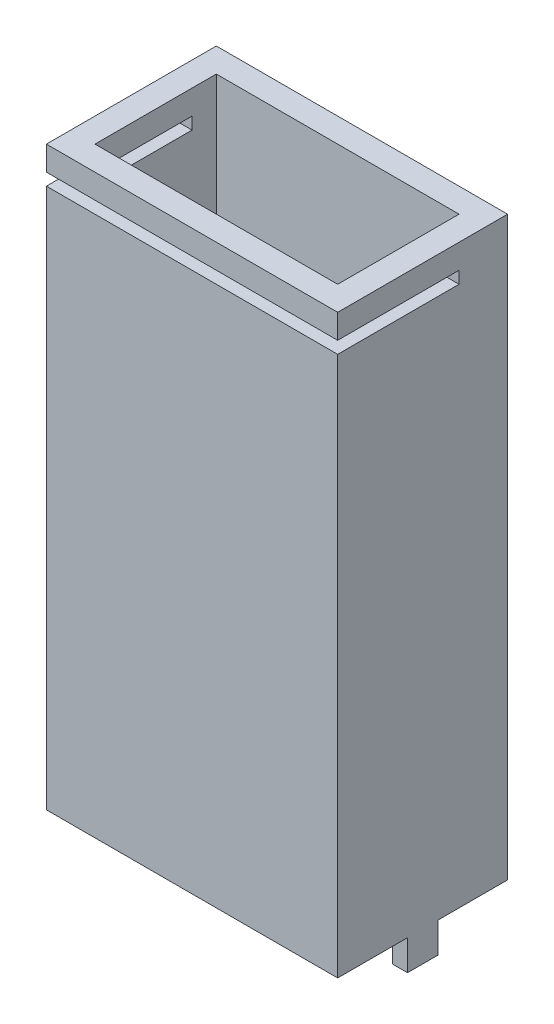
ISO-10303-21;
HEADER;
FILE_DESCRIPTION(('STEP AP214'),'2;1');
FILE_NAME('part.step','',(''),(''),'','','');
FILE_SCHEMA(('AUTOMOTIVE_DESIGN { 1 0 10303 214 1 1 1 1 }'));
ENDSEC;
DATA;
#1=APPLICATION_CONTEXT('core data for automotive mechanical design processes');
#2=APPLICATION_PROTOCOL_DEFINITION('international standard','automotive_design',2000,#1);
#3=PRODUCT_CONTEXT('',#1,'mechanical');
#4=PRODUCT('Part','Part','',(#3));
#5=PRODUCT_RELATED_PRODUCT_CATEGORY('part','',(#4));
#6=PRODUCT_DEFINITION_FORMATION('','',#4);
#7=PRODUCT_DEFINITION_CONTEXT('part definition',#1,'design');
#8=PRODUCT_DEFINITION('design','',#6,#7);
#9=PRODUCT_DEFINITION_SHAPE('','',#8);
#10=(LENGTH_UNIT() NAMED_UNIT(*) SI_UNIT(.MILLI.,.METRE.));
#11=(NAMED_UNIT(*) PLANE_ANGLE_UNIT() SI_UNIT($,.RADIAN.));
#12=(NAMED_UNIT(*) SI_UNIT($,.STERADIAN.) SOLID_ANGLE_UNIT());
#13=UNCERTAINTY_MEASURE_WITH_UNIT(LENGTH_MEASURE(1.E-05),#10,'distance_accuracy_value','');
#14=(GEOMETRIC_REPRESENTATION_CONTEXT(3) GLOBAL_UNCERTAINTY_ASSIGNED_CONTEXT((#13)) GLOBAL_UNIT_ASSIGNED_CONTEXT((#10,
#11,#12)) REPRESENTATION_CONTEXT('',''));
#15=CARTESIAN_POINT('',(0.,0.,0.));
#16=DIRECTION('',(0.,0.,1.));
#17=DIRECTION('',(1.,0.,0.));
#18=AXIS2_PLACEMENT_3D('',#15,#16,#17);
#19=CARTESIAN_POINT('',(-4.,95.,24.));
#20=DIRECTION('',(0.,0.,-1.));
#21=DIRECTION('',(-1.,0.,0.));
#22=AXIS2_PLACEMENT_3D('',#19,#20,#21);
#23=PLANE('',#22);
#24=DIRECTION('',(0.,-1.,0.));
#25=VECTOR('',#24,1.);
#26=CARTESIAN_POINT('',(-4.,95.,24.));
#27=LINE('',#26,#25);
#28=CARTESIAN_POINT('',(-4.,95.,24.));
#29=VERTEX_POINT('',#28);
#30=CARTESIAN_POINT('',(-4.,91.,24.));
#31=VERTEX_POINT('',#30);
#32=EDGE_CURVE('E405',#29,#31,#27,.T.);
#33=ORIENTED_EDGE('',*,*,#32,.T.);
#34=DIRECTION('',(-1.,0.,0.));
#35=VECTOR('',#34,1.);
#36=CARTESIAN_POINT('',(-6.59729798073271,91.,24.));
#37=LINE('',#36,#35);
#38=CARTESIAN_POINT('',(44.,91.,24.));
#39=VERTEX_POINT('',#38);
#40=EDGE_CURVE('E496',#39,#31,#37,.T.);
#41=ORIENTED_EDGE('',*,*,#40,.F.);
#42=DIRECTION('',(0.,-1.,0.));
#43=VECTOR('',#42,1.);
#44=CARTESIAN_POINT('',(44.,95.,24.));
#45=LINE('',#44,#43);
#46=CARTESIAN_POINT('',(44.,95.,24.));
#47=VERTEX_POINT('',#46);
#48=EDGE_CURVE('E226',#47,#39,#45,.T.);
#49=ORIENTED_EDGE('',*,*,#48,.F.);
#50=DIRECTION('',(1.,0.,0.));
#51=VECTOR('',#50,1.);
#52=CARTESIAN_POINT('',(-4.,95.,24.));
#53=LINE('',#52,#51);
#54=EDGE_CURVE('E368',#29,#47,#53,.T.);
#55=ORIENTED_EDGE('',*,*,#54,.F.);
#56=EDGE_LOOP('',(#33,#41,#49,#55));
#57=FACE_BOUND('',#56,.T.);
#58=ADVANCED_FACE('F45',(#57),#23,.F.);
#59=CARTESIAN_POINT('',(0.,95.,20.));
#60=DIRECTION('',(0.,0.,-1.));
#61=DIRECTION('',(-1.,0.,0.));
#62=AXIS2_PLACEMENT_3D('',#59,#60,#61);
#63=PLANE('',#62);
#64=DIRECTION('',(1.,0.,0.));
#65=VECTOR('',#64,1.);
#66=CARTESIAN_POINT('',(0.,91.,20.));
#67=LINE('',#66,#65);
#68=CARTESIAN_POINT('',(0.,91.,20.));
#69=VERTEX_POINT('',#68);
#70=CARTESIAN_POINT('',(40.,91.,20.));
#71=VERTEX_POINT('',#70);
#72=EDGE_CURVE('E236',#69,#71,#67,.T.);
#73=ORIENTED_EDGE('',*,*,#72,.F.);
#74=DIRECTION('',(0.,-1.,0.));
#75=VECTOR('',#74,1.);
#76=CARTESIAN_POINT('',(0.,95.,20.));
#77=LINE('',#76,#75);
#78=CARTESIAN_POINT('',(0.,95.,20.));
#79=VERTEX_POINT('',#78);
#80=EDGE_CURVE('E359',#79,#69,#77,.T.);
#81=ORIENTED_EDGE('',*,*,#80,.F.);
#82=DIRECTION('',(1.,0.,0.));
#83=VECTOR('',#82,1.);
#84=CARTESIAN_POINT('',(0.,95.,20.));
#85=LINE('',#84,#83);
#86=CARTESIAN_POINT('',(40.,95.,20.));
#87=VERTEX_POINT('',#86);
#88=EDGE_CURVE('E321',#79,#87,#85,.T.);
#89=ORIENTED_EDGE('',*,*,#88,.T.);
#90=DIRECTION('',(0.,-1.,0.));
#91=VECTOR('',#90,1.);
#92=CARTESIAN_POINT('',(40.,95.,20.));
#93=LINE('',#92,#91);
#94=EDGE_CURVE('E354',#87,#71,#93,.T.);
#95=ORIENTED_EDGE('',*,*,#94,.T.);
#96=EDGE_LOOP('',(#73,#81,#89,#95));
#97=FACE_BOUND('',#96,.T.);
#98=ADVANCED_FACE('F472',(#97),#63,.T.);
#99=CARTESIAN_POINT('',(0.,0.,0.));
#100=DIRECTION('',(0.,1.,0.));
#101=DIRECTION('',(0.,0.,1.));
#102=AXIS2_PLACEMENT_3D('',#99,#100,#101);
#103=PLANE('',#102);
#104=DIRECTION('',(0.,0.,1.));
#105=VECTOR('',#104,1.);
#106=CARTESIAN_POINT('',(0.,0.,0.));
#107=LINE('',#106,#105);
#108=CARTESIAN_POINT('',(0.,0.,0.));
#109=VERTEX_POINT('',#108);
#110=CARTESIAN_POINT('',(0.,0.,20.));
#111=VERTEX_POINT('',#110);
#112=EDGE_CURVE('E317',#109,#111,#107,.T.);
#113=ORIENTED_EDGE('',*,*,#112,.T.);
#114=DIRECTION('',(1.,0.,0.));
#115=VECTOR('',#114,1.);
#116=CARTESIAN_POINT('',(0.,0.,20.));
#117=LINE('',#116,#115);
#118=CARTESIAN_POINT('',(40.,0.,20.));
#119=VERTEX_POINT('',#118);
#120=EDGE_CURVE('E336',#111,#119,#117,.T.);
#121=ORIENTED_EDGE('',*,*,#120,.T.);
#122=DIRECTION('',(0.,0.,-1.));
#123=VECTOR('',#122,1.);
#124=CARTESIAN_POINT('',(40.,0.,0.));
#125=LINE('',#124,#123);
#126=CARTESIAN_POINT('',(40.,0.,0.));
#127=VERTEX_POINT('',#126);
#128=EDGE_CURVE('E340',#119,#127,#125,.T.);
#129=ORIENTED_EDGE('',*,*,#128,.T.);
#130=DIRECTION('',(-1.,0.,0.));
#131=VECTOR('',#130,1.);
#132=CARTESIAN_POINT('',(0.,0.,0.));
#133=LINE('',#132,#131);
#134=EDGE_CURVE('E322',#127,#109,#133,.T.);
#135=ORIENTED_EDGE('',*,*,#134,.T.);
#136=EDGE_LOOP('',(#113,#121,#129,#135));
#137=FACE_BOUND('',#136,.T.);
#138=DIRECTION('',(1.,0.,0.));
#139=VECTOR('',#138,1.);
#140=CARTESIAN_POINT('',(41.5,0.,7.50000000000001));
#141=LINE('',#140,#139);
#142=CARTESIAN_POINT('',(41.5,0.,7.50000000000001));
#143=VERTEX_POINT('',#142);
#144=CARTESIAN_POINT('',(44.,0.,7.5));
#145=VERTEX_POINT('',#144);
#146=EDGE_CURVE('E256',#143,#145,#141,.T.);
#147=ORIENTED_EDGE('',*,*,#146,.F.);
#148=DIRECTION('',(0.,0.,-1.));
#149=VECTOR('',#148,1.);
#150=CARTESIAN_POINT('',(41.5,0.,12.5));
#151=LINE('',#150,#149);
#152=CARTESIAN_POINT('',(41.5,0.,12.5));
#153=VERTEX_POINT('',#152);
#154=EDGE_CURVE('E261',#153,#143,#151,.T.);
#155=ORIENTED_EDGE('',*,*,#154,.F.);
#156=DIRECTION('',(-1.,0.,0.));
#157=VECTOR('',#156,1.);
#158=CARTESIAN_POINT('',(41.5,0.,12.5));
#159=LINE('',#158,#157);
#160=CARTESIAN_POINT('',(44.,0.,12.5));
#161=VERTEX_POINT('',#160);
#162=EDGE_CURVE('E253',#161,#153,#159,.T.);
#163=ORIENTED_EDGE('',*,*,#162,.F.);
#164=DIRECTION('',(0.,0.,-1.));
#165=VECTOR('',#164,1.);
#166=CARTESIAN_POINT('',(44.,0.,-4.));
#167=LINE('',#166,#165);
#168=CARTESIAN_POINT('',(44.,0.,24.));
#169=VERTEX_POINT('',#168);
#170=EDGE_CURVE('E388',#169,#161,#167,.T.);
#171=ORIENTED_EDGE('',*,*,#170,.F.);
#172=DIRECTION('',(1.,0.,0.));
#173=VECTOR('',#172,1.);
#174=CARTESIAN_POINT('',(-4.,0.,24.));
#175=LINE('',#174,#173);
#176=CARTESIAN_POINT('',(-4.,0.,24.));
#177=VERTEX_POINT('',#176);
#178=EDGE_CURVE('E383',#177,#169,#175,.T.);
#179=ORIENTED_EDGE('',*,*,#178,.F.);
#180=DIRECTION('',(0.,0.,1.));
#181=VECTOR('',#180,1.);
#182=CARTESIAN_POINT('',(-4.,0.,-4.));
#183=LINE('',#182,#181);
#184=CARTESIAN_POINT('',(-4.,0.,12.5));
#185=VERTEX_POINT('',#184);
#186=EDGE_CURVE('E363',#185,#177,#183,.T.);
#187=ORIENTED_EDGE('',*,*,#186,.F.);
#188=DIRECTION('',(-1.,0.,0.));
#189=VECTOR('',#188,1.);
#190=CARTESIAN_POINT('',(-4.,0.,12.5));
#191=LINE('',#190,#189);
#192=CARTESIAN_POINT('',(-1.5,0.,12.5));
#193=VERTEX_POINT('',#192);
#194=EDGE_CURVE('E282',#193,#185,#191,.T.);
#195=ORIENTED_EDGE('',*,*,#194,.F.);
#196=DIRECTION('',(0.,0.,1.));
#197=VECTOR('',#196,1.);
#198=CARTESIAN_POINT('',(-1.5,0.,12.5));
#199=LINE('',#198,#197);
#200=CARTESIAN_POINT('',(-1.5,0.,7.5));
#201=VERTEX_POINT('',#200);
#202=EDGE_CURVE('E295',#201,#193,#199,.T.);
#203=ORIENTED_EDGE('',*,*,#202,.F.);
#204=DIRECTION('',(1.,0.,0.));
#205=VECTOR('',#204,1.);
#206=CARTESIAN_POINT('',(-4.,0.,7.5));
#207=LINE('',#206,#205);
#208=CARTESIAN_POINT('',(-4.,0.,7.5));
#209=VERTEX_POINT('',#208);
#210=EDGE_CURVE('E265',#209,#201,#207,.T.);
#211=ORIENTED_EDGE('',*,*,#210,.F.);
#212=CARTESIAN_POINT('',(-4.,0.,-4.));
#213=VERTEX_POINT('',#212);
#214=EDGE_CURVE('E379',#213,#209,#183,.T.);
#215=ORIENTED_EDGE('',*,*,#214,.F.);
#216=DIRECTION('',(-1.,0.,0.));
#217=VECTOR('',#216,1.);
#218=CARTESIAN_POINT('',(-4.,0.,-4.));
#219=LINE('',#218,#217);
#220=CARTESIAN_POINT('',(44.,0.,-4.));
#221=VERTEX_POINT('',#220);
#222=EDGE_CURVE('E369',#221,#213,#219,.T.);
#223=ORIENTED_EDGE('',*,*,#222,.F.);
#224=EDGE_CURVE('E387',#145,#221,#167,.T.);
#225=ORIENTED_EDGE('',*,*,#224,.F.);
#226=EDGE_LOOP('',(#147,#155,#163,#171,#179,#187,#195,#203,#211,#215,#223,#225));
#227=FACE_BOUND('',#226,.T.);
#228=ADVANCED_FACE('F451',(#137,#227),#103,.F.);
#229=CARTESIAN_POINT('',(0.,95.,0.));
#230=DIRECTION('',(0.,1.,0.));
#231=DIRECTION('',(0.,0.,1.));
#232=AXIS2_PLACEMENT_3D('',#229,#230,#231);
#233=PLANE('',#232);
#234=DIRECTION('',(0.,0.,1.));
#235=VECTOR('',#234,1.);
#236=CARTESIAN_POINT('',(-4.,95.,-4.));
#237=LINE('',#236,#235);
#238=CARTESIAN_POINT('',(-4.,95.,-4.));
#239=VERTEX_POINT('',#238);
#240=EDGE_CURVE('E364',#239,#29,#237,.T.);
#241=ORIENTED_EDGE('',*,*,#240,.T.);
#242=ORIENTED_EDGE('',*,*,#54,.T.);
#243=DIRECTION('',(0.,0.,-1.));
#244=VECTOR('',#243,1.);
#245=CARTESIAN_POINT('',(44.,95.,-4.));
#246=LINE('',#245,#244);
#247=CARTESIAN_POINT('',(44.,95.,-4.));
#248=VERTEX_POINT('',#247);
#249=EDGE_CURVE('E372',#47,#248,#246,.T.);
#250=ORIENTED_EDGE('',*,*,#249,.T.);
#251=DIRECTION('',(-1.,0.,0.));
#252=VECTOR('',#251,1.);
#253=CARTESIAN_POINT('',(-4.,95.,-4.));
#254=LINE('',#253,#252);
#255=EDGE_CURVE('E375',#248,#239,#254,.T.);
#256=ORIENTED_EDGE('',*,*,#255,.T.);
#257=EDGE_LOOP('',(#241,#242,#250,#256));
#258=FACE_BOUND('',#257,.T.);
#259=ORIENTED_EDGE('',*,*,#88,.F.);
#260=DIRECTION('',(0.,0.,1.));
#261=VECTOR('',#260,1.);
#262=CARTESIAN_POINT('',(0.,95.,0.));
#263=LINE('',#262,#261);
#264=CARTESIAN_POINT('',(0.,95.,0.));
#265=VERTEX_POINT('',#264);
#266=EDGE_CURVE('E318',#265,#79,#263,.T.);
#267=ORIENTED_EDGE('',*,*,#266,.F.);
#268=DIRECTION('',(-1.,0.,0.));
#269=VECTOR('',#268,1.);
#270=CARTESIAN_POINT('',(0.,95.,0.));
#271=LINE('',#270,#269);
#272=CARTESIAN_POINT('',(40.,95.,0.));
#273=VERTEX_POINT('',#272);
#274=EDGE_CURVE('E329',#273,#265,#271,.T.);
#275=ORIENTED_EDGE('',*,*,#274,.F.);
#276=DIRECTION('',(0.,0.,-1.));
#277=VECTOR('',#276,1.);
#278=CARTESIAN_POINT('',(40.,95.,0.));
#279=LINE('',#278,#277);
#280=EDGE_CURVE('E325',#87,#273,#279,.T.);
#281=ORIENTED_EDGE('',*,*,#280,.F.);
#282=EDGE_LOOP('',(#259,#267,#275,#281));
#283=FACE_BOUND('',#282,.T.);
#284=ADVANCED_FACE('F476',(#258,#283),#233,.T.);
#285=CARTESIAN_POINT('',(-4.,95.,-4.));
#286=DIRECTION('',(1.,0.,0.));
#287=DIRECTION('',(0.,0.,-1.));
#288=AXIS2_PLACEMENT_3D('',#285,#286,#287);
#289=PLANE('',#288);
#290=DIRECTION('',(0.,-1.,0.));
#291=VECTOR('',#290,1.);
#292=CARTESIAN_POINT('',(-4.,95.,4.));
#293=LINE('',#292,#291);
#294=CARTESIAN_POINT('',(-4.,91.,4.));
#295=VERTEX_POINT('',#294);
#296=CARTESIAN_POINT('',(-4.,89.,4.));
#297=VERTEX_POINT('',#296);
#298=EDGE_CURVE('E209',#295,#297,#293,.T.);
#299=ORIENTED_EDGE('',*,*,#298,.F.);
#300=DIRECTION('',(0.,0.,1.));
#301=VECTOR('',#300,1.);
#302=CARTESIAN_POINT('',(-4.,91.,-4.));
#303=LINE('',#302,#301);
#304=EDGE_CURVE('E228',#295,#31,#303,.T.);
#305=ORIENTED_EDGE('',*,*,#304,.T.);
#306=ORIENTED_EDGE('',*,*,#32,.F.);
#307=ORIENTED_EDGE('',*,*,#240,.F.);
#308=DIRECTION('',(0.,-1.,0.));
#309=VECTOR('',#308,1.);
#310=CARTESIAN_POINT('',(-4.,95.,-4.));
#311=LINE('',#310,#309);
#312=EDGE_CURVE('E378',#239,#213,#311,.T.);
#313=ORIENTED_EDGE('',*,*,#312,.T.);
#314=ORIENTED_EDGE('',*,*,#214,.T.);
#315=DIRECTION('',(0.,1.,0.));
#316=VECTOR('',#315,1.);
#317=CARTESIAN_POINT('',(-4.,-5.,7.5));
#318=LINE('',#317,#316);
#319=CARTESIAN_POINT('',(-4.,-5.,7.5));
#320=VERTEX_POINT('',#319);
#321=EDGE_CURVE('E313',#320,#209,#318,.T.);
#322=ORIENTED_EDGE('',*,*,#321,.F.);
#323=DIRECTION('',(0.,0.,-1.));
#324=VECTOR('',#323,1.);
#325=CARTESIAN_POINT('',(-4.,-5.,12.5));
#326=LINE('',#325,#324);
#327=CARTESIAN_POINT('',(-4.,-5.,12.5));
#328=VERTEX_POINT('',#327);
#329=EDGE_CURVE('E277',#328,#320,#326,.T.);
#330=ORIENTED_EDGE('',*,*,#329,.F.);
#331=DIRECTION('',(0.,1.,0.));
#332=VECTOR('',#331,1.);
#333=CARTESIAN_POINT('',(-4.,-5.,12.5));
#334=LINE('',#333,#332);
#335=EDGE_CURVE('E291',#328,#185,#334,.T.);
#336=ORIENTED_EDGE('',*,*,#335,.T.);
#337=ORIENTED_EDGE('',*,*,#186,.T.);
#338=CARTESIAN_POINT('',(-4.,89.,24.));
#339=VERTEX_POINT('',#338);
#340=EDGE_CURVE('E404',#339,#177,#27,.T.);
#341=ORIENTED_EDGE('',*,*,#340,.F.);
#342=DIRECTION('',(0.,0.,-1.));
#343=VECTOR('',#342,1.);
#344=CARTESIAN_POINT('',(-4.,89.,-4.));
#345=LINE('',#344,#343);
#346=EDGE_CURVE('E459',#339,#297,#345,.T.);
#347=ORIENTED_EDGE('',*,*,#346,.T.);
#348=EDGE_LOOP('',(#299,#305,#306,#307,#313,#314,#322,#330,#336,#337,#341,#347));
#349=FACE_BOUND('',#348,.T.);
#350=ADVANCED_FACE('F47',(#349),#289,.F.);
#351=CARTESIAN_POINT('',(44.,89.,24.));
#352=VERTEX_POINT('',#351);
#353=EDGE_CURVE('E401',#352,#169,#45,.T.);
#354=ORIENTED_EDGE('',*,*,#353,.F.);
#355=DIRECTION('',(1.,0.,0.));
#356=VECTOR('',#355,1.);
#357=CARTESIAN_POINT('',(-6.59729798073271,89.,24.));
#358=LINE('',#357,#356);
#359=EDGE_CURVE('E443',#339,#352,#358,.T.);
#360=ORIENTED_EDGE('',*,*,#359,.F.);
#361=ORIENTED_EDGE('',*,*,#340,.T.);
#362=ORIENTED_EDGE('',*,*,#178,.T.);
#363=EDGE_LOOP('',(#354,#360,#361,#362));
#364=FACE_BOUND('',#363,.T.);
#365=ADVANCED_FACE('F440',(#364),#23,.F.);
#366=CARTESIAN_POINT('',(44.,95.,-4.));
#367=DIRECTION('',(-1.,0.,0.));
#368=DIRECTION('',(0.,0.,1.));
#369=AXIS2_PLACEMENT_3D('',#366,#367,#368);
#370=PLANE('',#369);
#371=ORIENTED_EDGE('',*,*,#48,.T.);
#372=DIRECTION('',(0.,0.,-1.));
#373=VECTOR('',#372,1.);
#374=CARTESIAN_POINT('',(44.,91.,-4.));
#375=LINE('',#374,#373);
#376=CARTESIAN_POINT('',(44.,91.,4.));
#377=VERTEX_POINT('',#376);
#378=EDGE_CURVE('E215',#39,#377,#375,.T.);
#379=ORIENTED_EDGE('',*,*,#378,.T.);
#380=DIRECTION('',(0.,1.,0.));
#381=VECTOR('',#380,1.);
#382=CARTESIAN_POINT('',(44.,95.,4.));
#383=LINE('',#382,#381);
#384=CARTESIAN_POINT('',(44.,89.,4.));
#385=VERTEX_POINT('',#384);
#386=EDGE_CURVE('E203',#385,#377,#383,.T.);
#387=ORIENTED_EDGE('',*,*,#386,.F.);
#388=DIRECTION('',(0.,0.,1.));
#389=VECTOR('',#388,1.);
#390=CARTESIAN_POINT('',(44.,89.,-4.));
#391=LINE('',#390,#389);
#392=EDGE_CURVE('E457',#385,#352,#391,.T.);
#393=ORIENTED_EDGE('',*,*,#392,.T.);
#394=ORIENTED_EDGE('',*,*,#353,.T.);
#395=ORIENTED_EDGE('',*,*,#170,.T.);
#396=DIRECTION('',(0.,1.,0.));
#397=VECTOR('',#396,1.);
#398=CARTESIAN_POINT('',(44.,-5.,12.5));
#399=LINE('',#398,#397);
#400=CARTESIAN_POINT('',(44.,-5.,12.5));
#401=VERTEX_POINT('',#400);
#402=EDGE_CURVE('E245',#401,#161,#399,.T.);
#403=ORIENTED_EDGE('',*,*,#402,.F.);
#404=DIRECTION('',(0.,0.,1.));
#405=VECTOR('',#404,1.);
#406=CARTESIAN_POINT('',(44.,-5.,12.5));
#407=LINE('',#406,#405);
#408=CARTESIAN_POINT('',(44.,-5.,7.5));
#409=VERTEX_POINT('',#408);
#410=EDGE_CURVE('E268',#409,#401,#407,.T.);
#411=ORIENTED_EDGE('',*,*,#410,.F.);
#412=DIRECTION('',(0.,1.,0.));
#413=VECTOR('',#412,1.);
#414=CARTESIAN_POINT('',(44.,-5.,7.5));
#415=LINE('',#414,#413);
#416=EDGE_CURVE('E242',#409,#145,#415,.T.);
#417=ORIENTED_EDGE('',*,*,#416,.T.);
#418=ORIENTED_EDGE('',*,*,#224,.T.);
#419=DIRECTION('',(0.,-1.,0.));
#420=VECTOR('',#419,1.);
#421=CARTESIAN_POINT('',(44.,95.,-4.));
#422=LINE('',#421,#420);
#423=EDGE_CURVE('E397',#248,#221,#422,.T.);
#424=ORIENTED_EDGE('',*,*,#423,.F.);
#425=ORIENTED_EDGE('',*,*,#249,.F.);
#426=EDGE_LOOP('',(#371,#379,#387,#393,#394,#395,#403,#411,#417,#418,#424,#425));
#427=FACE_BOUND('',#426,.T.);
#428=ADVANCED_FACE('F223',(#427),#370,.F.);
#429=CARTESIAN_POINT('',(-4.,95.,-4.));
#430=DIRECTION('',(0.,0.,1.));
#431=DIRECTION('',(1.,0.,0.));
#432=AXIS2_PLACEMENT_3D('',#429,#430,#431);
#433=PLANE('',#432);
#434=ORIENTED_EDGE('',*,*,#222,.T.);
#435=ORIENTED_EDGE('',*,*,#312,.F.);
#436=ORIENTED_EDGE('',*,*,#255,.F.);
#437=ORIENTED_EDGE('',*,*,#423,.T.);
#438=EDGE_LOOP('',(#434,#435,#436,#437));
#439=FACE_BOUND('',#438,.T.);
#440=ADVANCED_FACE('F549',(#439),#433,.F.);
#441=CARTESIAN_POINT('',(0.,95.,0.));
#442=DIRECTION('',(1.,0.,0.));
#443=DIRECTION('',(0.,0.,-1.));
#444=AXIS2_PLACEMENT_3D('',#441,#442,#443);
#445=PLANE('',#444);
#446=DIRECTION('',(0.,0.,1.));
#447=VECTOR('',#446,1.);
#448=CARTESIAN_POINT('',(0.,91.,0.));
#449=LINE('',#448,#447);
#450=CARTESIAN_POINT('',(0.,91.,4.));
#451=VERTEX_POINT('',#450);
#452=EDGE_CURVE('E229',#451,#69,#449,.T.);
#453=ORIENTED_EDGE('',*,*,#452,.F.);
#454=DIRECTION('',(0.,-1.,0.));
#455=VECTOR('',#454,1.);
#456=CARTESIAN_POINT('',(0.,95.,4.));
#457=LINE('',#456,#455);
#458=CARTESIAN_POINT('',(0.,89.,4.));
#459=VERTEX_POINT('',#458);
#460=EDGE_CURVE('E210',#451,#459,#457,.T.);
#461=ORIENTED_EDGE('',*,*,#460,.T.);
#462=DIRECTION('',(0.,0.,-1.));
#463=VECTOR('',#462,1.);
#464=CARTESIAN_POINT('',(0.,89.,0.));
#465=LINE('',#464,#463);
#466=CARTESIAN_POINT('',(0.,89.,20.));
#467=VERTEX_POINT('',#466);
#468=EDGE_CURVE('E426',#467,#459,#465,.T.);
#469=ORIENTED_EDGE('',*,*,#468,.F.);
#470=EDGE_CURVE('E358',#467,#111,#77,.T.);
#471=ORIENTED_EDGE('',*,*,#470,.T.);
#472=ORIENTED_EDGE('',*,*,#112,.F.);
#473=DIRECTION('',(0.,-1.,0.));
#474=VECTOR('',#473,1.);
#475=CARTESIAN_POINT('',(0.,95.,0.));
#476=LINE('',#475,#474);
#477=EDGE_CURVE('E332',#265,#109,#476,.T.);
#478=ORIENTED_EDGE('',*,*,#477,.F.);
#479=ORIENTED_EDGE('',*,*,#266,.T.);
#480=ORIENTED_EDGE('',*,*,#80,.T.);
#481=EDGE_LOOP('',(#453,#461,#469,#471,#472,#478,#479,#480));
#482=FACE_BOUND('',#481,.T.);
#483=ADVANCED_FACE('F484',(#482),#445,.T.);
#484=DIRECTION('',(-1.,0.,0.));
#485=VECTOR('',#484,1.);
#486=CARTESIAN_POINT('',(0.,89.,20.));
#487=LINE('',#486,#485);
#488=CARTESIAN_POINT('',(40.,89.,20.));
#489=VERTEX_POINT('',#488);
#490=EDGE_CURVE('E416',#489,#467,#487,.T.);
#491=ORIENTED_EDGE('',*,*,#490,.F.);
#492=EDGE_CURVE('E353',#489,#119,#93,.T.);
#493=ORIENTED_EDGE('',*,*,#492,.T.);
#494=ORIENTED_EDGE('',*,*,#120,.F.);
#495=ORIENTED_EDGE('',*,*,#470,.F.);
#496=EDGE_LOOP('',(#491,#493,#494,#495));
#497=FACE_BOUND('',#496,.T.);
#498=ADVANCED_FACE('F422',(#497),#63,.T.);
#499=CARTESIAN_POINT('',(40.,95.,0.));
#500=DIRECTION('',(-1.,0.,0.));
#501=DIRECTION('',(0.,0.,1.));
#502=AXIS2_PLACEMENT_3D('',#499,#500,#501);
#503=PLANE('',#502);
#504=DIRECTION('',(0.,0.,-1.));
#505=VECTOR('',#504,1.);
#506=CARTESIAN_POINT('',(40.,91.,0.));
#507=LINE('',#506,#505);
#508=CARTESIAN_POINT('',(40.,91.,4.));
#509=VERTEX_POINT('',#508);
#510=EDGE_CURVE('E11',#71,#509,#507,.T.);
#511=ORIENTED_EDGE('',*,*,#510,.F.);
#512=ORIENTED_EDGE('',*,*,#94,.F.);
#513=ORIENTED_EDGE('',*,*,#280,.T.);
#514=DIRECTION('',(0.,-1.,0.));
#515=VECTOR('',#514,1.);
#516=CARTESIAN_POINT('',(40.,95.,0.));
#517=LINE('',#516,#515);
#518=EDGE_CURVE('E350',#273,#127,#517,.T.);
#519=ORIENTED_EDGE('',*,*,#518,.T.);
#520=ORIENTED_EDGE('',*,*,#128,.F.);
#521=ORIENTED_EDGE('',*,*,#492,.F.);
#522=DIRECTION('',(0.,0.,1.));
#523=VECTOR('',#522,1.);
#524=CARTESIAN_POINT('',(40.,89.,0.));
#525=LINE('',#524,#523);
#526=CARTESIAN_POINT('',(40.,89.,4.));
#527=VERTEX_POINT('',#526);
#528=EDGE_CURVE('E54',#527,#489,#525,.T.);
#529=ORIENTED_EDGE('',*,*,#528,.F.);
#530=DIRECTION('',(0.,1.,0.));
#531=VECTOR('',#530,1.);
#532=CARTESIAN_POINT('',(40.,95.,4.));
#533=LINE('',#532,#531);
#534=EDGE_CURVE('E409',#527,#509,#533,.T.);
#535=ORIENTED_EDGE('',*,*,#534,.T.);
#536=EDGE_LOOP('',(#511,#512,#513,#519,#520,#521,#529,#535));
#537=FACE_BOUND('',#536,.T.);
#538=ADVANCED_FACE('F428',(#537),#503,.T.);
#539=CARTESIAN_POINT('',(0.,95.,0.));
#540=DIRECTION('',(0.,0.,1.));
#541=DIRECTION('',(1.,0.,0.));
#542=AXIS2_PLACEMENT_3D('',#539,#540,#541);
#543=PLANE('',#542);
#544=ORIENTED_EDGE('',*,*,#134,.F.);
#545=ORIENTED_EDGE('',*,*,#518,.F.);
#546=ORIENTED_EDGE('',*,*,#274,.T.);
#547=ORIENTED_EDGE('',*,*,#477,.T.);
#548=EDGE_LOOP('',(#544,#545,#546,#547));
#549=FACE_BOUND('',#548,.T.);
#550=ADVANCED_FACE('F480',(#549),#543,.T.);
#551=CARTESIAN_POINT('',(-4.,-5.,7.5));
#552=DIRECTION('',(0.,0.,1.));
#553=DIRECTION('',(1.,0.,0.));
#554=AXIS2_PLACEMENT_3D('',#551,#552,#553);
#555=PLANE('',#554);
#556=ORIENTED_EDGE('',*,*,#210,.T.);
#557=DIRECTION('',(0.,1.,0.));
#558=VECTOR('',#557,1.);
#559=CARTESIAN_POINT('',(-1.5,-5.,7.5));
#560=LINE('',#559,#558);
#561=CARTESIAN_POINT('',(-1.5,-5.,7.5));
#562=VERTEX_POINT('',#561);
#563=EDGE_CURVE('E309',#562,#201,#560,.T.);
#564=ORIENTED_EDGE('',*,*,#563,.F.);
#565=DIRECTION('',(1.,0.,0.));
#566=VECTOR('',#565,1.);
#567=CARTESIAN_POINT('',(-4.,-5.,7.5));
#568=LINE('',#567,#566);
#569=EDGE_CURVE('E281',#320,#562,#568,.T.);
#570=ORIENTED_EDGE('',*,*,#569,.F.);
#571=ORIENTED_EDGE('',*,*,#321,.T.);
#572=EDGE_LOOP('',(#556,#564,#570,#571));
#573=FACE_BOUND('',#572,.T.);
#574=ADVANCED_FACE('F518',(#573),#555,.F.);
#575=CARTESIAN_POINT('',(-1.5,-5.,12.5));
#576=DIRECTION('',(-1.,0.,0.));
#577=DIRECTION('',(0.,0.,1.));
#578=AXIS2_PLACEMENT_3D('',#575,#576,#577);
#579=PLANE('',#578);
#580=ORIENTED_EDGE('',*,*,#202,.T.);
#581=DIRECTION('',(0.,1.,0.));
#582=VECTOR('',#581,1.);
#583=CARTESIAN_POINT('',(-1.5,-5.,12.5));
#584=LINE('',#583,#582);
#585=CARTESIAN_POINT('',(-1.5,-5.,12.5));
#586=VERTEX_POINT('',#585);
#587=EDGE_CURVE('E305',#586,#193,#584,.T.);
#588=ORIENTED_EDGE('',*,*,#587,.F.);
#589=DIRECTION('',(0.,0.,1.));
#590=VECTOR('',#589,1.);
#591=CARTESIAN_POINT('',(-1.5,-5.,12.5));
#592=LINE('',#591,#590);
#593=EDGE_CURVE('E285',#562,#586,#592,.T.);
#594=ORIENTED_EDGE('',*,*,#593,.F.);
#595=ORIENTED_EDGE('',*,*,#563,.T.);
#596=EDGE_LOOP('',(#580,#588,#594,#595));
#597=FACE_BOUND('',#596,.T.);
#598=ADVANCED_FACE('F521',(#597),#579,.F.);
#599=CARTESIAN_POINT('',(-4.,-5.,12.5));
#600=DIRECTION('',(0.,0.,-1.));
#601=DIRECTION('',(-1.,0.,0.));
#602=AXIS2_PLACEMENT_3D('',#599,#600,#601);
#603=PLANE('',#602);
#604=ORIENTED_EDGE('',*,*,#194,.T.);
#605=ORIENTED_EDGE('',*,*,#335,.F.);
#606=DIRECTION('',(-1.,0.,0.));
#607=VECTOR('',#606,1.);
#608=CARTESIAN_POINT('',(-4.,-5.,12.5));
#609=LINE('',#608,#607);
#610=EDGE_CURVE('E288',#586,#328,#609,.T.);
#611=ORIENTED_EDGE('',*,*,#610,.F.);
#612=ORIENTED_EDGE('',*,*,#587,.T.);
#613=EDGE_LOOP('',(#604,#605,#611,#612));
#614=FACE_BOUND('',#613,.T.);
#615=ADVANCED_FACE('F527',(#614),#603,.F.);
#616=CARTESIAN_POINT('',(0.,-5.,0.));
#617=DIRECTION('',(0.,-1.,0.));
#618=DIRECTION('',(0.,0.,-1.));
#619=AXIS2_PLACEMENT_3D('',#616,#617,#618);
#620=PLANE('',#619);
#621=ORIENTED_EDGE('',*,*,#329,.T.);
#622=ORIENTED_EDGE('',*,*,#569,.T.);
#623=ORIENTED_EDGE('',*,*,#593,.T.);
#624=ORIENTED_EDGE('',*,*,#610,.T.);
#625=EDGE_LOOP('',(#621,#622,#623,#624));
#626=FACE_BOUND('',#625,.T.);
#627=ADVANCED_FACE('F525',(#626),#620,.T.);
#628=CARTESIAN_POINT('',(41.5,-5.,12.5));
#629=DIRECTION('',(1.,0.,0.));
#630=DIRECTION('',(0.,0.,-1.));
#631=AXIS2_PLACEMENT_3D('',#628,#629,#630);
#632=PLANE('',#631);
#633=ORIENTED_EDGE('',*,*,#154,.T.);
#634=DIRECTION('',(0.,1.,0.));
#635=VECTOR('',#634,1.);
#636=CARTESIAN_POINT('',(41.5,-5.,7.50000000000001));
#637=LINE('',#636,#635);
#638=CARTESIAN_POINT('',(41.5,-5.,7.50000000000001));
#639=VERTEX_POINT('',#638);
#640=EDGE_CURVE('E234',#639,#143,#637,.T.);
#641=ORIENTED_EDGE('',*,*,#640,.F.);
#642=DIRECTION('',(0.,0.,-1.));
#643=VECTOR('',#642,1.);
#644=CARTESIAN_POINT('',(41.5,-5.,12.5));
#645=LINE('',#644,#643);
#646=CARTESIAN_POINT('',(41.5,-5.,12.5));
#647=VERTEX_POINT('',#646);
#648=EDGE_CURVE('E257',#647,#639,#645,.T.);
#649=ORIENTED_EDGE('',*,*,#648,.F.);
#650=DIRECTION('',(0.,1.,0.));
#651=VECTOR('',#650,1.);
#652=CARTESIAN_POINT('',(41.5,-5.,12.5));
#653=LINE('',#652,#651);
#654=EDGE_CURVE('E248',#647,#153,#653,.T.);
#655=ORIENTED_EDGE('',*,*,#654,.T.);
#656=EDGE_LOOP('',(#633,#641,#649,#655));
#657=FACE_BOUND('',#656,.T.);
#658=ADVANCED_FACE('F534',(#657),#632,.F.);
#659=CARTESIAN_POINT('',(41.5,-5.,7.50000000000001));
#660=DIRECTION('',(0.,0.,1.));
#661=DIRECTION('',(1.,0.,0.));
#662=AXIS2_PLACEMENT_3D('',#659,#660,#661);
#663=PLANE('',#662);
#664=ORIENTED_EDGE('',*,*,#146,.T.);
#665=ORIENTED_EDGE('',*,*,#416,.F.);
#666=DIRECTION('',(1.,0.,0.));
#667=VECTOR('',#666,1.);
#668=CARTESIAN_POINT('',(41.5,-5.,7.50000000000001));
#669=LINE('',#668,#667);
#670=EDGE_CURVE('E271',#639,#409,#669,.T.);
#671=ORIENTED_EDGE('',*,*,#670,.F.);
#672=ORIENTED_EDGE('',*,*,#640,.T.);
#673=EDGE_LOOP('',(#664,#665,#671,#672));
#674=FACE_BOUND('',#673,.T.);
#675=ADVANCED_FACE('F568',(#674),#663,.F.);
#676=CARTESIAN_POINT('',(41.5,-5.,12.5));
#677=DIRECTION('',(0.,0.,-1.));
#678=DIRECTION('',(-1.,0.,0.));
#679=AXIS2_PLACEMENT_3D('',#676,#677,#678);
#680=PLANE('',#679);
#681=ORIENTED_EDGE('',*,*,#162,.T.);
#682=ORIENTED_EDGE('',*,*,#654,.F.);
#683=DIRECTION('',(-1.,0.,0.));
#684=VECTOR('',#683,1.);
#685=CARTESIAN_POINT('',(41.5,-5.,12.5));
#686=LINE('',#685,#684);
#687=EDGE_CURVE('E252',#401,#647,#686,.T.);
#688=ORIENTED_EDGE('',*,*,#687,.F.);
#689=ORIENTED_EDGE('',*,*,#402,.T.);
#690=EDGE_LOOP('',(#681,#682,#688,#689));
#691=FACE_BOUND('',#690,.T.);
#692=ADVANCED_FACE('F574',(#691),#680,.F.);
#693=CARTESIAN_POINT('',(0.,-5.,0.));
#694=DIRECTION('',(0.,-1.,0.));
#695=DIRECTION('',(0.,0.,-1.));
#696=AXIS2_PLACEMENT_3D('',#693,#694,#695);
#697=PLANE('',#696);
#698=ORIENTED_EDGE('',*,*,#648,.T.);
#699=ORIENTED_EDGE('',*,*,#670,.T.);
#700=ORIENTED_EDGE('',*,*,#410,.T.);
#701=ORIENTED_EDGE('',*,*,#687,.T.);
#702=EDGE_LOOP('',(#698,#699,#700,#701));
#703=FACE_BOUND('',#702,.T.);
#704=ADVANCED_FACE('F576',(#703),#697,.T.);
#705=CARTESIAN_POINT('',(-6.59729798073271,91.,4.));
#706=DIRECTION('',(0.,1.,0.));
#707=DIRECTION('',(0.,0.,1.));
#708=AXIS2_PLACEMENT_3D('',#705,#706,#707);
#709=PLANE('',#708);
#710=DIRECTION('',(-1.,0.,0.));
#711=VECTOR('',#710,1.);
#712=CARTESIAN_POINT('',(-6.59729798073271,91.,4.));
#713=LINE('',#712,#711);
#714=EDGE_CURVE('E220',#451,#295,#713,.T.);
#715=ORIENTED_EDGE('',*,*,#714,.F.);
#716=ORIENTED_EDGE('',*,*,#452,.T.);
#717=ORIENTED_EDGE('',*,*,#72,.T.);
#718=ORIENTED_EDGE('',*,*,#510,.T.);
#719=EDGE_CURVE('E66',#377,#509,#713,.T.);
#720=ORIENTED_EDGE('',*,*,#719,.F.);
#721=ORIENTED_EDGE('',*,*,#378,.F.);
#722=ORIENTED_EDGE('',*,*,#40,.T.);
#723=ORIENTED_EDGE('',*,*,#304,.F.);
#724=EDGE_LOOP('',(#715,#716,#717,#718,#720,#721,#722,#723));
#725=FACE_BOUND('',#724,.T.);
#726=ADVANCED_FACE('F214',(#725),#709,.F.);
#727=CARTESIAN_POINT('',(-6.59729798073271,89.,4.));
#728=DIRECTION('',(0.,-1.,0.));
#729=DIRECTION('',(0.,0.,-1.));
#730=AXIS2_PLACEMENT_3D('',#727,#728,#729);
#731=PLANE('',#730);
#732=ORIENTED_EDGE('',*,*,#359,.T.);
#733=ORIENTED_EDGE('',*,*,#392,.F.);
#734=DIRECTION('',(1.,0.,0.));
#735=VECTOR('',#734,1.);
#736=CARTESIAN_POINT('',(-6.59729798073271,89.,4.));
#737=LINE('',#736,#735);
#738=EDGE_CURVE('E61',#527,#385,#737,.T.);
#739=ORIENTED_EDGE('',*,*,#738,.F.);
#740=ORIENTED_EDGE('',*,*,#528,.T.);
#741=ORIENTED_EDGE('',*,*,#490,.T.);
#742=ORIENTED_EDGE('',*,*,#468,.T.);
#743=EDGE_CURVE('E488',#297,#459,#737,.T.);
#744=ORIENTED_EDGE('',*,*,#743,.F.);
#745=ORIENTED_EDGE('',*,*,#346,.F.);
#746=EDGE_LOOP('',(#732,#733,#739,#740,#741,#742,#744,#745));
#747=FACE_BOUND('',#746,.T.);
#748=ADVANCED_FACE('F415',(#747),#731,.F.);
#749=CARTESIAN_POINT('',(0.,0.,4.));
#750=DIRECTION('',(0.,0.,1.));
#751=DIRECTION('',(1.,0.,0.));
#752=AXIS2_PLACEMENT_3D('',#749,#750,#751);
#753=PLANE('',#752);
#754=ORIENTED_EDGE('',*,*,#298,.T.);
#755=ORIENTED_EDGE('',*,*,#743,.T.);
#756=ORIENTED_EDGE('',*,*,#460,.F.);
#757=ORIENTED_EDGE('',*,*,#714,.T.);
#758=EDGE_LOOP('',(#754,#755,#756,#757));
#759=FACE_BOUND('',#758,.T.);
#760=ADVANCED_FACE('F490',(#759),#753,.T.);
#761=ORIENTED_EDGE('',*,*,#386,.T.);
#762=ORIENTED_EDGE('',*,*,#719,.T.);
#763=ORIENTED_EDGE('',*,*,#534,.F.);
#764=ORIENTED_EDGE('',*,*,#738,.T.);
#765=EDGE_LOOP('',(#761,#762,#763,#764));
#766=FACE_BOUND('',#765,.T.);
#767=ADVANCED_FACE('F204',(#766),#753,.T.);
#768=CLOSED_SHELL('',(#58,#98,#228,#284,#350,#365,#428,#440,#483,#498,#538,#550,#574,#598,#615,
#627,#658,#675,#692,#704,#726,#748,#760,#767));
#769=MANIFOLD_SOLID_BREP('B2',#768);
#770=ADVANCED_BREP_SHAPE_REPRESENTATION('',(#18,#769),#14);
#771=SHAPE_DEFINITION_REPRESENTATION(#9,#770);
ENDSEC;
END-ISO-10303-21;
